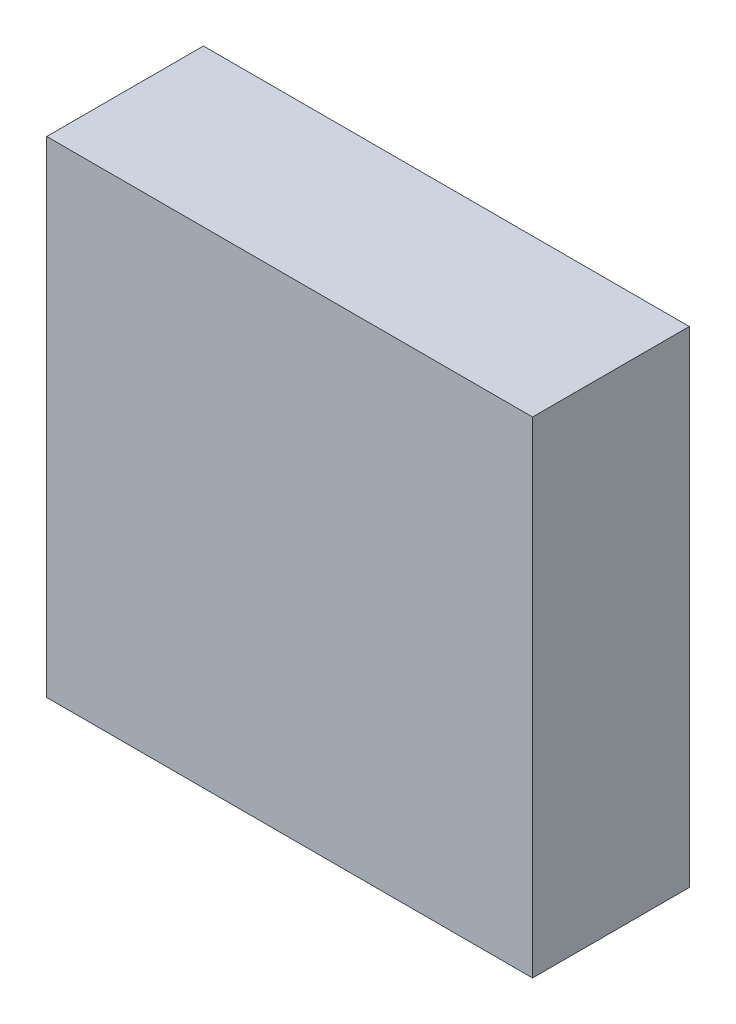
ISO-10303-21;
HEADER;
FILE_DESCRIPTION(('STEP AP214'),'2;1');
FILE_NAME('part.step','',(''),(''),'','','');
FILE_SCHEMA(('AUTOMOTIVE_DESIGN { 1 0 10303 214 1 1 1 1 }'));
ENDSEC;
DATA;
#1=APPLICATION_CONTEXT('core data for automotive mechanical design processes');
#2=APPLICATION_PROTOCOL_DEFINITION('international standard','automotive_design',2000,#1);
#3=PRODUCT_CONTEXT('',#1,'mechanical');
#4=PRODUCT('Part','Part','',(#3));
#5=PRODUCT_RELATED_PRODUCT_CATEGORY('part','',(#4));
#6=PRODUCT_DEFINITION_FORMATION('','',#4);
#7=PRODUCT_DEFINITION_CONTEXT('part definition',#1,'design');
#8=PRODUCT_DEFINITION('design','',#6,#7);
#9=PRODUCT_DEFINITION_SHAPE('','',#8);
#10=(LENGTH_UNIT() NAMED_UNIT(*) SI_UNIT(.MILLI.,.METRE.));
#11=(NAMED_UNIT(*) PLANE_ANGLE_UNIT() SI_UNIT($,.RADIAN.));
#12=(NAMED_UNIT(*) SI_UNIT($,.STERADIAN.) SOLID_ANGLE_UNIT());
#13=UNCERTAINTY_MEASURE_WITH_UNIT(LENGTH_MEASURE(1.E-05),#10,'distance_accuracy_value','');
#14=(GEOMETRIC_REPRESENTATION_CONTEXT(3) GLOBAL_UNCERTAINTY_ASSIGNED_CONTEXT((#13)) GLOBAL_UNIT_ASSIGNED_CONTEXT((#10,
#11,#12)) REPRESENTATION_CONTEXT('',''));
#15=CARTESIAN_POINT('',(0.,0.,0.));
#16=DIRECTION('',(0.,0.,1.));
#17=DIRECTION('',(1.,0.,0.));
#18=AXIS2_PLACEMENT_3D('',#15,#16,#17);
#19=CARTESIAN_POINT('',(-12.50000066,5.50000061,1.00000054));
#20=DIRECTION('',(0.,0.,-1.));
#21=DIRECTION('',(-1.,0.,0.));
#22=AXIS2_PLACEMENT_3D('',#19,#20,#21);
#23=PLANE('',#22);
#24=DIRECTION('',(1.,0.,0.));
#25=VECTOR('',#24,1.);
#26=CARTESIAN_POINT('',(-14.0500001,7.05000132,1.00000054));
#27=LINE('',#26,#25);
#28=CARTESIAN_POINT('',(-14.0500001,7.05000132,1.00000054));
#29=VERTEX_POINT('',#28);
#30=CARTESIAN_POINT('',(-10.95000122,7.05000132,1.00000054));
#31=VERTEX_POINT('',#30);
#32=EDGE_CURVE('E68',#29,#31,#27,.T.);
#33=ORIENTED_EDGE('',*,*,#32,.F.);
#34=DIRECTION('',(0.,1.,0.));
#35=VECTOR('',#34,1.);
#36=CARTESIAN_POINT('',(-14.0500001,3.9499999,1.00000054));
#37=LINE('',#36,#35);
#38=CARTESIAN_POINT('',(-14.0500001,3.9499999,1.00000054));
#39=VERTEX_POINT('',#38);
#40=EDGE_CURVE('E55',#39,#29,#37,.T.);
#41=ORIENTED_EDGE('',*,*,#40,.F.);
#42=DIRECTION('',(1.,0.,0.));
#43=VECTOR('',#42,1.);
#44=CARTESIAN_POINT('',(-10.95000122,3.9499999,1.00000054));
#45=LINE('',#44,#43);
#46=CARTESIAN_POINT('',(-10.95000122,3.9499999,1.00000054));
#47=VERTEX_POINT('',#46);
#48=EDGE_CURVE('E20',#47,#39,#45,.F.);
#49=ORIENTED_EDGE('',*,*,#48,.F.);
#50=DIRECTION('',(0.,1.,0.));
#51=VECTOR('',#50,1.);
#52=CARTESIAN_POINT('',(-10.95000122,7.05000132,1.00000054));
#53=LINE('',#52,#51);
#54=EDGE_CURVE('E80',#31,#47,#53,.F.);
#55=ORIENTED_EDGE('',*,*,#54,.F.);
#56=EDGE_LOOP('',(#33,#41,#49,#55));
#57=FACE_BOUND('',#56,.T.);
#58=ADVANCED_FACE('F17',(#57),#23,.F.);
#59=CARTESIAN_POINT('',(-10.95000122,3.9499999,0.));
#60=DIRECTION('',(0.,-1.,0.));
#61=DIRECTION('',(0.,0.,-1.));
#62=AXIS2_PLACEMENT_3D('',#59,#60,#61);
#63=PLANE('',#62);
#64=DIRECTION('',(0.,0.,1.));
#65=VECTOR('',#64,1.);
#66=CARTESIAN_POINT('',(-14.0500001,3.9499999,0.));
#67=LINE('',#66,#65);
#68=CARTESIAN_POINT('',(-14.0500001,3.9499999,0.));
#69=VERTEX_POINT('',#68);
#70=EDGE_CURVE('E61',#69,#39,#67,.T.);
#71=ORIENTED_EDGE('',*,*,#70,.F.);
#72=DIRECTION('',(-1.,0.,0.));
#73=VECTOR('',#72,1.);
#74=CARTESIAN_POINT('',(-12.50000066,3.9499999,0.));
#75=LINE('',#74,#73);
#76=CARTESIAN_POINT('',(-10.95000122,3.9499999,0.));
#77=VERTEX_POINT('',#76);
#78=EDGE_CURVE('E83',#77,#69,#75,.T.);
#79=ORIENTED_EDGE('',*,*,#78,.F.);
#80=DIRECTION('',(0.,0.,-1.));
#81=VECTOR('',#80,1.);
#82=CARTESIAN_POINT('',(-10.95000122,3.9499999,0.));
#83=LINE('',#82,#81);
#84=EDGE_CURVE('E64',#47,#77,#83,.T.);
#85=ORIENTED_EDGE('',*,*,#84,.F.);
#86=ORIENTED_EDGE('',*,*,#48,.T.);
#87=EDGE_LOOP('',(#71,#79,#85,#86));
#88=FACE_BOUND('',#87,.T.);
#89=ADVANCED_FACE('F60',(#88),#63,.T.);
#90=CARTESIAN_POINT('',(-14.0500001,3.9499999,0.));
#91=DIRECTION('',(-1.,0.,0.));
#92=DIRECTION('',(0.,0.,1.));
#93=AXIS2_PLACEMENT_3D('',#90,#91,#92);
#94=PLANE('',#93);
#95=DIRECTION('',(0.,0.,1.));
#96=VECTOR('',#95,1.);
#97=CARTESIAN_POINT('',(-14.0500001,7.05000132,0.));
#98=LINE('',#97,#96);
#99=CARTESIAN_POINT('',(-14.0500001,7.05000132,0.));
#100=VERTEX_POINT('',#99);
#101=EDGE_CURVE('E70',#100,#29,#98,.T.);
#102=ORIENTED_EDGE('',*,*,#101,.F.);
#103=DIRECTION('',(0.,1.,0.));
#104=VECTOR('',#103,1.);
#105=CARTESIAN_POINT('',(-14.0500001,5.50000061,0.));
#106=LINE('',#105,#104);
#107=EDGE_CURVE('E74',#69,#100,#106,.T.);
#108=ORIENTED_EDGE('',*,*,#107,.F.);
#109=ORIENTED_EDGE('',*,*,#70,.T.);
#110=ORIENTED_EDGE('',*,*,#40,.T.);
#111=EDGE_LOOP('',(#102,#108,#109,#110));
#112=FACE_BOUND('',#111,.T.);
#113=ADVANCED_FACE('F72',(#112),#94,.T.);
#114=CARTESIAN_POINT('',(-14.0500001,7.05000132,0.));
#115=DIRECTION('',(0.,1.,0.));
#116=DIRECTION('',(0.,0.,1.));
#117=AXIS2_PLACEMENT_3D('',#114,#115,#116);
#118=PLANE('',#117);
#119=DIRECTION('',(0.,0.,-1.));
#120=VECTOR('',#119,1.);
#121=CARTESIAN_POINT('',(-10.95000122,7.05000132,0.));
#122=LINE('',#121,#120);
#123=CARTESIAN_POINT('',(-10.95000122,7.05000132,0.));
#124=VERTEX_POINT('',#123);
#125=EDGE_CURVE('E35',#124,#31,#122,.F.);
#126=ORIENTED_EDGE('',*,*,#125,.F.);
#127=DIRECTION('',(-1.,0.,0.));
#128=VECTOR('',#127,1.);
#129=CARTESIAN_POINT('',(-12.50000066,7.05000132,0.));
#130=LINE('',#129,#128);
#131=EDGE_CURVE('E26',#100,#124,#130,.F.);
#132=ORIENTED_EDGE('',*,*,#131,.F.);
#133=ORIENTED_EDGE('',*,*,#101,.T.);
#134=ORIENTED_EDGE('',*,*,#32,.T.);
#135=EDGE_LOOP('',(#126,#132,#133,#134));
#136=FACE_BOUND('',#135,.T.);
#137=ADVANCED_FACE('F89',(#136),#118,.T.);
#138=CARTESIAN_POINT('',(-10.95000122,7.05000132,0.));
#139=DIRECTION('',(1.,0.,0.));
#140=DIRECTION('',(0.,0.,-1.));
#141=AXIS2_PLACEMENT_3D('',#138,#139,#140);
#142=PLANE('',#141);
#143=ORIENTED_EDGE('',*,*,#84,.T.);
#144=DIRECTION('',(0.,1.,0.));
#145=VECTOR('',#144,1.);
#146=CARTESIAN_POINT('',(-10.95000122,5.50000061,0.));
#147=LINE('',#146,#145);
#148=EDGE_CURVE('E11',#124,#77,#147,.F.);
#149=ORIENTED_EDGE('',*,*,#148,.F.);
#150=ORIENTED_EDGE('',*,*,#125,.T.);
#151=ORIENTED_EDGE('',*,*,#54,.T.);
#152=EDGE_LOOP('',(#143,#149,#150,#151));
#153=FACE_BOUND('',#152,.T.);
#154=ADVANCED_FACE('F91',(#153),#142,.T.);
#155=CARTESIAN_POINT('',(-12.50000066,5.50000061,0.));
#156=DIRECTION('',(0.,0.,-1.));
#157=DIRECTION('',(-1.,0.,0.));
#158=AXIS2_PLACEMENT_3D('',#155,#156,#157);
#159=PLANE('',#158);
#160=ORIENTED_EDGE('',*,*,#131,.T.);
#161=ORIENTED_EDGE('',*,*,#148,.T.);
#162=ORIENTED_EDGE('',*,*,#78,.T.);
#163=ORIENTED_EDGE('',*,*,#107,.T.);
#164=EDGE_LOOP('',(#160,#161,#162,#163));
#165=FACE_BOUND('',#164,.T.);
#166=ADVANCED_FACE('F88',(#165),#159,.T.);
#167=CLOSED_SHELL('',(#58,#89,#113,#137,#154,#166));
#168=MANIFOLD_SOLID_BREP('B1',#167);
#169=ADVANCED_BREP_SHAPE_REPRESENTATION('',(#18,#168),#14);
#170=SHAPE_DEFINITION_REPRESENTATION(#9,#169);
ENDSEC;
END-ISO-10303-21;
